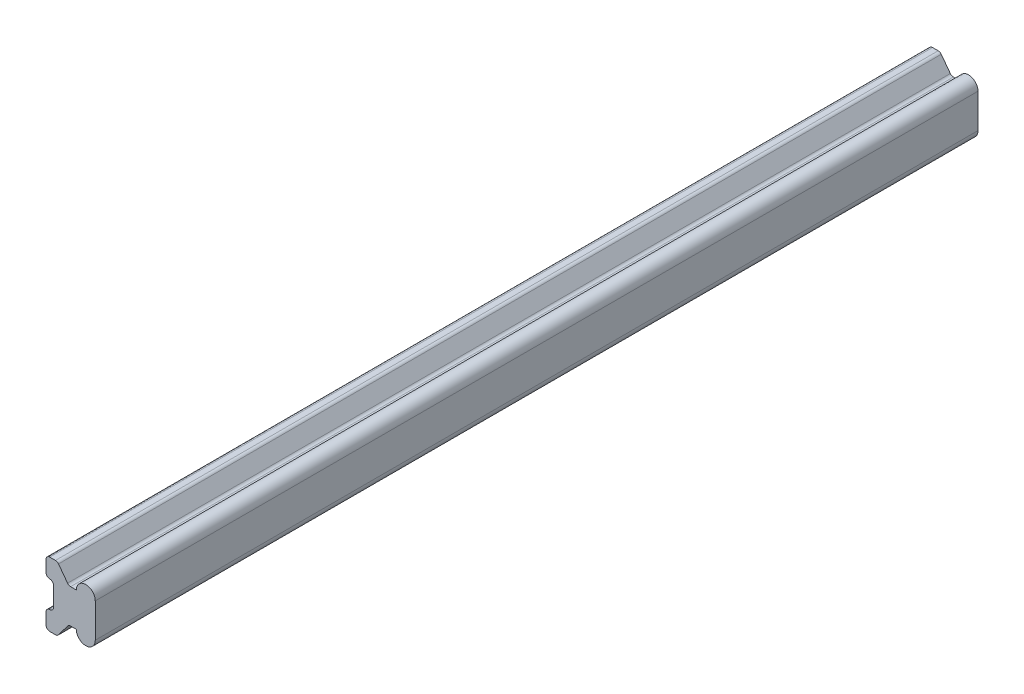
ISO-10303-21;
HEADER;
FILE_DESCRIPTION(('STEP AP214'),'2;1');
FILE_NAME('part.step','',(''),(''),'','','');
FILE_SCHEMA(('AUTOMOTIVE_DESIGN { 1 0 10303 214 1 1 1 1 }'));
ENDSEC;
DATA;
#1=APPLICATION_CONTEXT('core data for automotive mechanical design processes');
#2=APPLICATION_PROTOCOL_DEFINITION('international standard','automotive_design',2000,#1);
#3=PRODUCT_CONTEXT('',#1,'mechanical');
#4=PRODUCT('Part','Part','',(#3));
#5=PRODUCT_RELATED_PRODUCT_CATEGORY('part','',(#4));
#6=PRODUCT_DEFINITION_FORMATION('','',#4);
#7=PRODUCT_DEFINITION_CONTEXT('part definition',#1,'design');
#8=PRODUCT_DEFINITION('design','',#6,#7);
#9=PRODUCT_DEFINITION_SHAPE('','',#8);
#10=(LENGTH_UNIT() NAMED_UNIT(*) SI_UNIT(.MILLI.,.METRE.));
#11=(NAMED_UNIT(*) PLANE_ANGLE_UNIT() SI_UNIT($,.RADIAN.));
#12=(NAMED_UNIT(*) SI_UNIT($,.STERADIAN.) SOLID_ANGLE_UNIT());
#13=UNCERTAINTY_MEASURE_WITH_UNIT(LENGTH_MEASURE(1.E-05),#10,'distance_accuracy_value','');
#14=(GEOMETRIC_REPRESENTATION_CONTEXT(3) GLOBAL_UNCERTAINTY_ASSIGNED_CONTEXT((#13)) GLOBAL_UNIT_ASSIGNED_CONTEXT((#10,
#11,#12)) REPRESENTATION_CONTEXT('',''));
#15=CARTESIAN_POINT('',(0.,0.,0.));
#16=DIRECTION('',(0.,0.,1.));
#17=DIRECTION('',(1.,0.,0.));
#18=AXIS2_PLACEMENT_3D('',#15,#16,#17);
#19=CARTESIAN_POINT('',(-2.,-3.5,233.));
#20=DIRECTION('',(1.,0.,0.));
#21=DIRECTION('',(0.,1.,0.));
#22=AXIS2_PLACEMENT_3D('',#19,#20,#21);
#23=PLANE('',#22);
#24=DIRECTION('',(0.,-1.,0.));
#25=VECTOR('',#24,1.);
#26=CARTESIAN_POINT('',(-2.,-3.5,0.));
#27=LINE('',#26,#25);
#28=CARTESIAN_POINT('',(-2.,-4.5,0.));
#29=VERTEX_POINT('',#28);
#30=CARTESIAN_POINT('',(-2.,-7.5,0.));
#31=VERTEX_POINT('',#30);
#32=EDGE_CURVE('E230',#29,#31,#27,.T.);
#33=ORIENTED_EDGE('',*,*,#32,.T.);
#34=DIRECTION('',(0.,0.,-1.));
#35=VECTOR('',#34,1.);
#36=CARTESIAN_POINT('',(-2.,-7.5,233.));
#37=LINE('',#36,#35);
#38=CARTESIAN_POINT('',(-2.,-7.5,233.));
#39=VERTEX_POINT('',#38);
#40=EDGE_CURVE('E305',#31,#39,#37,.F.);
#41=ORIENTED_EDGE('',*,*,#40,.T.);
#42=DIRECTION('',(0.,-1.,0.));
#43=VECTOR('',#42,1.);
#44=CARTESIAN_POINT('',(-2.,-3.5,233.));
#45=LINE('',#44,#43);
#46=CARTESIAN_POINT('',(-2.,-4.5,233.));
#47=VERTEX_POINT('',#46);
#48=EDGE_CURVE('E610',#47,#39,#45,.T.);
#49=ORIENTED_EDGE('',*,*,#48,.F.);
#50=DIRECTION('',(0.,0.,-1.));
#51=VECTOR('',#50,1.);
#52=CARTESIAN_POINT('',(-2.,-4.5,233.));
#53=LINE('',#52,#51);
#54=EDGE_CURVE('E302',#47,#29,#53,.T.);
#55=ORIENTED_EDGE('',*,*,#54,.T.);
#56=EDGE_LOOP('',(#33,#41,#49,#55));
#57=FACE_BOUND('',#56,.T.);
#58=ADVANCED_FACE('F32',(#57),#23,.F.);
#59=CARTESIAN_POINT('',(1.,-8.5,233.));
#60=DIRECTION('',(0.,1.,0.));
#61=DIRECTION('',(0.,0.,1.));
#62=AXIS2_PLACEMENT_3D('',#59,#60,#61);
#63=PLANE('',#62);
#64=DIRECTION('',(1.,0.,0.));
#65=VECTOR('',#64,1.);
#66=CARTESIAN_POINT('',(1.,-8.5,0.));
#67=LINE('',#66,#65);
#68=CARTESIAN_POINT('',(-1.,-8.5,0.));
#69=VERTEX_POINT('',#68);
#70=CARTESIAN_POINT('',(0.5,-8.5,0.));
#71=VERTEX_POINT('',#70);
#72=EDGE_CURVE('E233',#69,#71,#67,.T.);
#73=ORIENTED_EDGE('',*,*,#72,.T.);
#74=DIRECTION('',(0.,0.,-1.));
#75=VECTOR('',#74,1.);
#76=CARTESIAN_POINT('',(0.5,-8.5,233.));
#77=LINE('',#76,#75);
#78=CARTESIAN_POINT('',(0.5,-8.5,233.));
#79=VERTEX_POINT('',#78);
#80=EDGE_CURVE('E289',#71,#79,#77,.F.);
#81=ORIENTED_EDGE('',*,*,#80,.T.);
#82=DIRECTION('',(1.,0.,0.));
#83=VECTOR('',#82,1.);
#84=CARTESIAN_POINT('',(1.,-8.5,233.));
#85=LINE('',#84,#83);
#86=CARTESIAN_POINT('',(-1.,-8.5,233.));
#87=VERTEX_POINT('',#86);
#88=EDGE_CURVE('E609',#87,#79,#85,.T.);
#89=ORIENTED_EDGE('',*,*,#88,.F.);
#90=DIRECTION('',(0.,0.,-1.));
#91=VECTOR('',#90,1.);
#92=CARTESIAN_POINT('',(-1.,-8.5,233.));
#93=LINE('',#92,#91);
#94=EDGE_CURVE('E286',#87,#69,#93,.T.);
#95=ORIENTED_EDGE('',*,*,#94,.T.);
#96=EDGE_LOOP('',(#73,#81,#89,#95));
#97=FACE_BOUND('',#96,.T.);
#98=ADVANCED_FACE('F400',(#97),#63,.F.);
#99=CARTESIAN_POINT('',(1.,-8.5,233.));
#100=DIRECTION('',(-0.8,0.6,0.));
#101=DIRECTION('',(-0.6,-0.8,0.));
#102=AXIS2_PLACEMENT_3D('',#99,#100,#101);
#103=PLANE('',#102);
#104=DIRECTION('',(0.6,0.8,0.));
#105=VECTOR('',#104,1.);
#106=CARTESIAN_POINT('',(1.,-8.5,0.));
#107=LINE('',#106,#105);
#108=CARTESIAN_POINT('',(1.3,-8.1,0.));
#109=VERTEX_POINT('',#108);
#110=CARTESIAN_POINT('',(3.7,-4.9,0.));
#111=VERTEX_POINT('',#110);
#112=EDGE_CURVE('E237',#109,#111,#107,.T.);
#113=ORIENTED_EDGE('',*,*,#112,.T.);
#114=DIRECTION('',(0.,0.,-1.));
#115=VECTOR('',#114,1.);
#116=CARTESIAN_POINT('',(3.7,-4.9,233.));
#117=LINE('',#116,#115);
#118=CARTESIAN_POINT('',(3.7,-4.9,233.));
#119=VERTEX_POINT('',#118);
#120=EDGE_CURVE('E272',#111,#119,#117,.F.);
#121=ORIENTED_EDGE('',*,*,#120,.T.);
#122=DIRECTION('',(0.6,0.8,0.));
#123=VECTOR('',#122,1.);
#124=CARTESIAN_POINT('',(1.,-8.5,233.));
#125=LINE('',#124,#123);
#126=CARTESIAN_POINT('',(1.3,-8.1,233.));
#127=VERTEX_POINT('',#126);
#128=EDGE_CURVE('E195',#127,#119,#125,.T.);
#129=ORIENTED_EDGE('',*,*,#128,.F.);
#130=DIRECTION('',(0.,0.,-1.));
#131=VECTOR('',#130,1.);
#132=CARTESIAN_POINT('',(1.3,-8.1,233.));
#133=LINE('',#132,#131);
#134=EDGE_CURVE('E269',#127,#109,#133,.T.);
#135=ORIENTED_EDGE('',*,*,#134,.T.);
#136=EDGE_LOOP('',(#113,#121,#129,#135));
#137=FACE_BOUND('',#136,.T.);
#138=ADVANCED_FACE('F406',(#137),#103,.F.);
#139=CARTESIAN_POINT('',(6.,-4.5,233.));
#140=DIRECTION('',(0.,1.,0.));
#141=DIRECTION('',(0.,0.,1.));
#142=AXIS2_PLACEMENT_3D('',#139,#140,#141);
#143=PLANE('',#142);
#144=DIRECTION('',(1.,0.,0.));
#145=VECTOR('',#144,1.);
#146=CARTESIAN_POINT('',(6.,-4.5,233.));
#147=LINE('',#146,#145);
#148=CARTESIAN_POINT('',(4.5,-4.5,233.));
#149=VERTEX_POINT('',#148);
#150=CARTESIAN_POINT('',(6.,-4.5,233.));
#151=VERTEX_POINT('',#150);
#152=EDGE_CURVE('E182',#149,#151,#147,.T.);
#153=ORIENTED_EDGE('',*,*,#152,.F.);
#154=DIRECTION('',(0.,0.,-1.));
#155=VECTOR('',#154,1.);
#156=CARTESIAN_POINT('',(4.5,-4.5,0.));
#157=LINE('',#156,#155);
#158=CARTESIAN_POINT('',(4.5,-4.5,0.));
#159=VERTEX_POINT('',#158);
#160=EDGE_CURVE('E205',#149,#159,#157,.T.);
#161=ORIENTED_EDGE('',*,*,#160,.T.);
#162=DIRECTION('',(1.,0.,0.));
#163=VECTOR('',#162,1.);
#164=CARTESIAN_POINT('',(6.,-4.5,0.));
#165=LINE('',#164,#163);
#166=CARTESIAN_POINT('',(6.,-4.5,0.));
#167=VERTEX_POINT('',#166);
#168=EDGE_CURVE('E201',#159,#167,#165,.T.);
#169=ORIENTED_EDGE('',*,*,#168,.T.);
#170=DIRECTION('',(0.,0.,-1.));
#171=VECTOR('',#170,1.);
#172=CARTESIAN_POINT('',(6.,-4.5,233.));
#173=LINE('',#172,#171);
#174=EDGE_CURVE('E198',#151,#167,#173,.T.);
#175=ORIENTED_EDGE('',*,*,#174,.F.);
#176=EDGE_LOOP('',(#153,#161,#169,#175));
#177=FACE_BOUND('',#176,.T.);
#178=ADVANCED_FACE('F199',(#177),#143,.F.);
#179=CARTESIAN_POINT('',(8.5,-4.5,233.));
#180=DIRECTION('',(0.,0.,-1.));
#181=DIRECTION('',(-1.,0.,0.));
#182=AXIS2_PLACEMENT_3D('',#179,#180,#181);
#183=CYLINDRICAL_SURFACE('',#182,2.5);
#184=CARTESIAN_POINT('',(8.5,-4.5,0.));
#185=DIRECTION('',(0.,0.,1.));
#186=DIRECTION('',(1.,0.,0.));
#187=AXIS2_PLACEMENT_3D('',#184,#185,#186);
#188=CIRCLE('',#187,2.5);
#189=CARTESIAN_POINT('',(11.,-4.5,0.));
#190=VERTEX_POINT('',#189);
#191=EDGE_CURVE('E241',#167,#190,#188,.T.);
#192=ORIENTED_EDGE('',*,*,#191,.T.);
#193=DIRECTION('',(0.,0.,-1.));
#194=VECTOR('',#193,1.);
#195=CARTESIAN_POINT('',(11.,-4.5,233.));
#196=LINE('',#195,#194);
#197=CARTESIAN_POINT('',(11.,-4.5,233.));
#198=VERTEX_POINT('',#197);
#199=EDGE_CURVE('E206',#198,#190,#196,.T.);
#200=ORIENTED_EDGE('',*,*,#199,.F.);
#201=CARTESIAN_POINT('',(8.5,-4.5,233.));
#202=DIRECTION('',(0.,0.,1.));
#203=DIRECTION('',(1.,0.,0.));
#204=AXIS2_PLACEMENT_3D('',#201,#202,#203);
#205=CIRCLE('',#204,2.5);
#206=EDGE_CURVE('E187',#151,#198,#205,.T.);
#207=ORIENTED_EDGE('',*,*,#206,.F.);
#208=ORIENTED_EDGE('',*,*,#174,.T.);
#209=EDGE_LOOP('',(#192,#200,#207,#208));
#210=FACE_BOUND('',#209,.T.);
#211=ADVANCED_FACE('F208',(#210),#183,.T.);
#212=CARTESIAN_POINT('',(11.,0.,233.));
#213=DIRECTION('',(-1.,0.,0.));
#214=DIRECTION('',(0.,0.,1.));
#215=AXIS2_PLACEMENT_3D('',#212,#213,#214);
#216=PLANE('',#215);
#217=DIRECTION('',(0.,1.,0.));
#218=VECTOR('',#217,1.);
#219=CARTESIAN_POINT('',(11.,0.,0.));
#220=LINE('',#219,#218);
#221=CARTESIAN_POINT('',(11.,4.5,0.));
#222=VERTEX_POINT('',#221);
#223=EDGE_CURVE('E243',#190,#222,#220,.T.);
#224=ORIENTED_EDGE('',*,*,#223,.T.);
#225=DIRECTION('',(0.,0.,-1.));
#226=VECTOR('',#225,1.);
#227=CARTESIAN_POINT('',(11.,4.5,233.));
#228=LINE('',#227,#226);
#229=CARTESIAN_POINT('',(11.,4.5,233.));
#230=VERTEX_POINT('',#229);
#231=EDGE_CURVE('E264',#230,#222,#228,.T.);
#232=ORIENTED_EDGE('',*,*,#231,.F.);
#233=DIRECTION('',(0.,1.,0.));
#234=VECTOR('',#233,1.);
#235=CARTESIAN_POINT('',(11.,0.,233.));
#236=LINE('',#235,#234);
#237=EDGE_CURVE('E211',#198,#230,#236,.T.);
#238=ORIENTED_EDGE('',*,*,#237,.F.);
#239=ORIENTED_EDGE('',*,*,#199,.T.);
#240=EDGE_LOOP('',(#224,#232,#238,#239));
#241=FACE_BOUND('',#240,.T.);
#242=ADVANCED_FACE('F390',(#241),#216,.F.);
#243=CARTESIAN_POINT('',(8.5,4.5,233.));
#244=DIRECTION('',(0.,0.,-1.));
#245=DIRECTION('',(-1.,0.,0.));
#246=AXIS2_PLACEMENT_3D('',#243,#244,#245);
#247=CYLINDRICAL_SURFACE('',#246,2.5);
#248=CARTESIAN_POINT('',(8.5,4.5,0.));
#249=DIRECTION('',(0.,0.,1.));
#250=DIRECTION('',(1.,0.,0.));
#251=AXIS2_PLACEMENT_3D('',#248,#249,#250);
#252=CIRCLE('',#251,2.5);
#253=CARTESIAN_POINT('',(6.,4.5,0.));
#254=VERTEX_POINT('',#253);
#255=EDGE_CURVE('E245',#222,#254,#252,.T.);
#256=ORIENTED_EDGE('',*,*,#255,.T.);
#257=DIRECTION('',(0.,0.,-1.));
#258=VECTOR('',#257,1.);
#259=CARTESIAN_POINT('',(6.,4.5,233.));
#260=LINE('',#259,#258);
#261=CARTESIAN_POINT('',(6.,4.5,233.));
#262=VERTEX_POINT('',#261);
#263=EDGE_CURVE('E229',#262,#254,#260,.T.);
#264=ORIENTED_EDGE('',*,*,#263,.F.);
#265=CARTESIAN_POINT('',(8.5,4.5,233.));
#266=DIRECTION('',(0.,0.,1.));
#267=DIRECTION('',(1.,0.,0.));
#268=AXIS2_PLACEMENT_3D('',#265,#266,#267);
#269=CIRCLE('',#268,2.5);
#270=EDGE_CURVE('E213',#230,#262,#269,.T.);
#271=ORIENTED_EDGE('',*,*,#270,.F.);
#272=ORIENTED_EDGE('',*,*,#231,.T.);
#273=EDGE_LOOP('',(#256,#264,#271,#272));
#274=FACE_BOUND('',#273,.T.);
#275=ADVANCED_FACE('F387',(#274),#247,.T.);
#276=CARTESIAN_POINT('',(4.,4.5,233.));
#277=DIRECTION('',(0.,-1.,0.));
#278=DIRECTION('',(0.,0.,-1.));
#279=AXIS2_PLACEMENT_3D('',#276,#277,#278);
#280=PLANE('',#279);
#281=DIRECTION('',(-1.,0.,0.));
#282=VECTOR('',#281,1.);
#283=CARTESIAN_POINT('',(4.,4.5,0.));
#284=LINE('',#283,#282);
#285=CARTESIAN_POINT('',(4.5,4.5,0.));
#286=VERTEX_POINT('',#285);
#287=EDGE_CURVE('E247',#254,#286,#284,.T.);
#288=ORIENTED_EDGE('',*,*,#287,.T.);
#289=DIRECTION('',(0.,0.,-1.));
#290=VECTOR('',#289,1.);
#291=CARTESIAN_POINT('',(4.5,4.5,233.));
#292=LINE('',#291,#290);
#293=CARTESIAN_POINT('',(4.5,4.5,233.));
#294=VERTEX_POINT('',#293);
#295=EDGE_CURVE('E326',#286,#294,#292,.F.);
#296=ORIENTED_EDGE('',*,*,#295,.T.);
#297=DIRECTION('',(-1.,0.,0.));
#298=VECTOR('',#297,1.);
#299=CARTESIAN_POINT('',(4.,4.5,233.));
#300=LINE('',#299,#298);
#301=EDGE_CURVE('E218',#262,#294,#300,.T.);
#302=ORIENTED_EDGE('',*,*,#301,.F.);
#303=ORIENTED_EDGE('',*,*,#263,.T.);
#304=EDGE_LOOP('',(#288,#296,#302,#303));
#305=FACE_BOUND('',#304,.T.);
#306=ADVANCED_FACE('F382',(#305),#280,.F.);
#307=CARTESIAN_POINT('',(4.,4.5,233.));
#308=DIRECTION('',(-0.8,-0.6,0.));
#309=DIRECTION('',(0.6,-0.8,0.));
#310=AXIS2_PLACEMENT_3D('',#307,#308,#309);
#311=PLANE('',#310);
#312=DIRECTION('',(-0.6,0.8,0.));
#313=VECTOR('',#312,1.);
#314=CARTESIAN_POINT('',(4.,4.5,0.));
#315=LINE('',#314,#313);
#316=CARTESIAN_POINT('',(3.7,4.9,0.));
#317=VERTEX_POINT('',#316);
#318=CARTESIAN_POINT('',(1.3,8.1,0.));
#319=VERTEX_POINT('',#318);
#320=EDGE_CURVE('E250',#317,#319,#315,.T.);
#321=ORIENTED_EDGE('',*,*,#320,.T.);
#322=DIRECTION('',(0.,0.,-1.));
#323=VECTOR('',#322,1.);
#324=CARTESIAN_POINT('',(1.3,8.1,233.));
#325=LINE('',#324,#323);
#326=CARTESIAN_POINT('',(1.3,8.1,233.));
#327=VERTEX_POINT('',#326);
#328=EDGE_CURVE('E324',#319,#327,#325,.F.);
#329=ORIENTED_EDGE('',*,*,#328,.T.);
#330=DIRECTION('',(-0.6,0.8,0.));
#331=VECTOR('',#330,1.);
#332=CARTESIAN_POINT('',(4.,4.5,233.));
#333=LINE('',#332,#331);
#334=CARTESIAN_POINT('',(3.7,4.9,233.));
#335=VERTEX_POINT('',#334);
#336=EDGE_CURVE('E221',#335,#327,#333,.T.);
#337=ORIENTED_EDGE('',*,*,#336,.F.);
#338=DIRECTION('',(0.,0.,-1.));
#339=VECTOR('',#338,1.);
#340=CARTESIAN_POINT('',(3.7,4.9,0.));
#341=LINE('',#340,#339);
#342=EDGE_CURVE('E321',#335,#317,#341,.T.);
#343=ORIENTED_EDGE('',*,*,#342,.T.);
#344=EDGE_LOOP('',(#321,#329,#337,#343));
#345=FACE_BOUND('',#344,.T.);
#346=ADVANCED_FACE('F373',(#345),#311,.F.);
#347=CARTESIAN_POINT('',(-2.,8.5,233.));
#348=DIRECTION('',(0.,-1.,0.));
#349=DIRECTION('',(0.,0.,-1.));
#350=AXIS2_PLACEMENT_3D('',#347,#348,#349);
#351=PLANE('',#350);
#352=DIRECTION('',(-1.,0.,0.));
#353=VECTOR('',#352,1.);
#354=CARTESIAN_POINT('',(-2.,8.5,0.));
#355=LINE('',#354,#353);
#356=CARTESIAN_POINT('',(0.5,8.5,0.));
#357=VERTEX_POINT('',#356);
#358=CARTESIAN_POINT('',(-1.,8.5,0.));
#359=VERTEX_POINT('',#358);
#360=EDGE_CURVE('E253',#357,#359,#355,.T.);
#361=ORIENTED_EDGE('',*,*,#360,.T.);
#362=DIRECTION('',(0.,0.,-1.));
#363=VECTOR('',#362,1.);
#364=CARTESIAN_POINT('',(-1.,8.5,233.));
#365=LINE('',#364,#363);
#366=CARTESIAN_POINT('',(-1.,8.5,233.));
#367=VERTEX_POINT('',#366);
#368=EDGE_CURVE('E319',#359,#367,#365,.F.);
#369=ORIENTED_EDGE('',*,*,#368,.T.);
#370=DIRECTION('',(-1.,0.,0.));
#371=VECTOR('',#370,1.);
#372=CARTESIAN_POINT('',(-2.,8.5,233.));
#373=LINE('',#372,#371);
#374=CARTESIAN_POINT('',(0.5,8.5,233.));
#375=VERTEX_POINT('',#374);
#376=EDGE_CURVE('E224',#375,#367,#373,.T.);
#377=ORIENTED_EDGE('',*,*,#376,.F.);
#378=DIRECTION('',(0.,0.,-1.));
#379=VECTOR('',#378,1.);
#380=CARTESIAN_POINT('',(0.5,8.5,233.));
#381=LINE('',#380,#379);
#382=EDGE_CURVE('E316',#375,#357,#381,.T.);
#383=ORIENTED_EDGE('',*,*,#382,.T.);
#384=EDGE_LOOP('',(#361,#369,#377,#383));
#385=FACE_BOUND('',#384,.T.);
#386=ADVANCED_FACE('F364',(#385),#351,.F.);
#387=CARTESIAN_POINT('',(-2.,3.5,233.));
#388=DIRECTION('',(1.,0.,0.));
#389=DIRECTION('',(0.,0.,-1.));
#390=AXIS2_PLACEMENT_3D('',#387,#388,#389);
#391=PLANE('',#390);
#392=DIRECTION('',(0.,-1.,0.));
#393=VECTOR('',#392,1.);
#394=CARTESIAN_POINT('',(-2.,3.5,0.));
#395=LINE('',#394,#393);
#396=CARTESIAN_POINT('',(-2.,7.5,0.));
#397=VERTEX_POINT('',#396);
#398=CARTESIAN_POINT('',(-2.,4.5,0.));
#399=VERTEX_POINT('',#398);
#400=EDGE_CURVE('E256',#397,#399,#395,.T.);
#401=ORIENTED_EDGE('',*,*,#400,.T.);
#402=DIRECTION('',(0.,0.,-1.));
#403=VECTOR('',#402,1.);
#404=CARTESIAN_POINT('',(-2.,4.5,233.));
#405=LINE('',#404,#403);
#406=CARTESIAN_POINT('',(-2.,4.5,233.));
#407=VERTEX_POINT('',#406);
#408=EDGE_CURVE('E57',#399,#407,#405,.F.);
#409=ORIENTED_EDGE('',*,*,#408,.T.);
#410=DIRECTION('',(0.,-1.,0.));
#411=VECTOR('',#410,1.);
#412=CARTESIAN_POINT('',(-2.,3.5,233.));
#413=LINE('',#412,#411);
#414=CARTESIAN_POINT('',(-2.,7.5,233.));
#415=VERTEX_POINT('',#414);
#416=EDGE_CURVE('E227',#415,#407,#413,.T.);
#417=ORIENTED_EDGE('',*,*,#416,.F.);
#418=DIRECTION('',(0.,0.,-1.));
#419=VECTOR('',#418,1.);
#420=CARTESIAN_POINT('',(-2.,7.5,233.));
#421=LINE('',#420,#419);
#422=EDGE_CURVE('E312',#415,#397,#421,.T.);
#423=ORIENTED_EDGE('',*,*,#422,.T.);
#424=EDGE_LOOP('',(#401,#409,#417,#423));
#425=FACE_BOUND('',#424,.T.);
#426=ADVANCED_FACE('F356',(#425),#391,.F.);
#427=CARTESIAN_POINT('',(0.,0.,233.));
#428=DIRECTION('',(1.,0.,0.));
#429=DIRECTION('',(0.,0.,-1.));
#430=AXIS2_PLACEMENT_3D('',#427,#428,#429);
#431=PLANE('',#430);
#432=DIRECTION('',(0.,-1.,0.));
#433=VECTOR('',#432,1.);
#434=CARTESIAN_POINT('',(0.,0.,0.));
#435=LINE('',#434,#433);
#436=CARTESIAN_POINT('',(0.,2.5,0.));
#437=VERTEX_POINT('',#436);
#438=CARTESIAN_POINT('',(0.,-2.5,0.));
#439=VERTEX_POINT('',#438);
#440=EDGE_CURVE('E258',#437,#439,#435,.T.);
#441=ORIENTED_EDGE('',*,*,#440,.T.);
#442=DIRECTION('',(0.,0.,-1.));
#443=VECTOR('',#442,1.);
#444=CARTESIAN_POINT('',(0.,-2.5,233.));
#445=LINE('',#444,#443);
#446=CARTESIAN_POINT('',(0.,-2.5,233.));
#447=VERTEX_POINT('',#446);
#448=EDGE_CURVE('E310',#439,#447,#445,.F.);
#449=ORIENTED_EDGE('',*,*,#448,.T.);
#450=DIRECTION('',(0.,-1.,0.));
#451=VECTOR('',#450,1.);
#452=CARTESIAN_POINT('',(0.,0.,233.));
#453=LINE('',#452,#451);
#454=CARTESIAN_POINT('',(0.,2.5,233.));
#455=VERTEX_POINT('',#454);
#456=EDGE_CURVE('E261',#455,#447,#453,.T.);
#457=ORIENTED_EDGE('',*,*,#456,.F.);
#458=DIRECTION('',(0.,0.,-1.));
#459=VECTOR('',#458,1.);
#460=CARTESIAN_POINT('',(0.,2.5,0.));
#461=LINE('',#460,#459);
#462=EDGE_CURVE('E307',#455,#437,#461,.T.);
#463=ORIENTED_EDGE('',*,*,#462,.T.);
#464=EDGE_LOOP('',(#441,#449,#457,#463));
#465=FACE_BOUND('',#464,.T.);
#466=ADVANCED_FACE('F510',(#465),#431,.F.);
#467=CARTESIAN_POINT('',(8.5,-4.5,233.));
#468=DIRECTION('',(0.,0.,1.));
#469=DIRECTION('',(1.,0.,0.));
#470=AXIS2_PLACEMENT_3D('',#467,#468,#469);
#471=PLANE('',#470);
#472=ORIENTED_EDGE('',*,*,#88,.T.);
#473=CARTESIAN_POINT('',(0.5,-7.5,233.));
#474=DIRECTION('',(0.,0.,1.));
#475=DIRECTION('',(1.,0.,0.));
#476=AXIS2_PLACEMENT_3D('',#473,#474,#475);
#477=CIRCLE('',#476,1.);
#478=EDGE_CURVE('E300',#79,#127,#477,.T.);
#479=ORIENTED_EDGE('',*,*,#478,.T.);
#480=ORIENTED_EDGE('',*,*,#128,.T.);
#481=CARTESIAN_POINT('',(4.5,-5.5,233.));
#482=DIRECTION('',(0.,0.,1.));
#483=DIRECTION('',(1.,0.,0.));
#484=AXIS2_PLACEMENT_3D('',#481,#482,#483);
#485=CIRCLE('',#484,1.);
#486=EDGE_CURVE('E191',#119,#149,#485,.F.);
#487=ORIENTED_EDGE('',*,*,#486,.T.);
#488=ORIENTED_EDGE('',*,*,#152,.T.);
#489=ORIENTED_EDGE('',*,*,#206,.T.);
#490=ORIENTED_EDGE('',*,*,#237,.T.);
#491=ORIENTED_EDGE('',*,*,#270,.T.);
#492=ORIENTED_EDGE('',*,*,#301,.T.);
#493=CARTESIAN_POINT('',(4.5,5.5,233.));
#494=DIRECTION('',(0.,0.,1.));
#495=DIRECTION('',(1.,0.,0.));
#496=AXIS2_PLACEMENT_3D('',#493,#494,#495);
#497=CIRCLE('',#496,1.);
#498=EDGE_CURVE('E11',#294,#335,#497,.F.);
#499=ORIENTED_EDGE('',*,*,#498,.T.);
#500=ORIENTED_EDGE('',*,*,#336,.T.);
#501=CARTESIAN_POINT('',(0.5,7.5,233.));
#502=DIRECTION('',(0.,0.,1.));
#503=DIRECTION('',(1.,0.,0.));
#504=AXIS2_PLACEMENT_3D('',#501,#502,#503);
#505=CIRCLE('',#504,1.);
#506=EDGE_CURVE('E291',#327,#375,#505,.T.);
#507=ORIENTED_EDGE('',*,*,#506,.T.);
#508=ORIENTED_EDGE('',*,*,#376,.T.);
#509=CARTESIAN_POINT('',(-1.,7.5,233.));
#510=DIRECTION('',(0.,0.,1.));
#511=DIRECTION('',(1.,0.,0.));
#512=AXIS2_PLACEMENT_3D('',#509,#510,#511);
#513=CIRCLE('',#512,1.);
#514=EDGE_CURVE('E293',#367,#415,#513,.T.);
#515=ORIENTED_EDGE('',*,*,#514,.T.);
#516=ORIENTED_EDGE('',*,*,#416,.T.);
#517=CARTESIAN_POINT('',(-1.,4.5,233.));
#518=DIRECTION('',(0.,0.,1.));
#519=DIRECTION('',(1.,0.,0.));
#520=AXIS2_PLACEMENT_3D('',#517,#518,#519);
#521=CIRCLE('',#520,1.);
#522=CARTESIAN_POINT('',(-1.,3.5,233.));
#523=VERTEX_POINT('',#522);
#524=EDGE_CURVE('E49',#407,#523,#521,.T.);
#525=ORIENTED_EDGE('',*,*,#524,.T.);
#526=CARTESIAN_POINT('',(-1.,2.5,233.));
#527=DIRECTION('',(0.,0.,1.));
#528=DIRECTION('',(1.,0.,0.));
#529=AXIS2_PLACEMENT_3D('',#526,#527,#528);
#530=CIRCLE('',#529,1.);
#531=EDGE_CURVE('E337',#523,#455,#530,.F.);
#532=ORIENTED_EDGE('',*,*,#531,.T.);
#533=ORIENTED_EDGE('',*,*,#456,.T.);
#534=CARTESIAN_POINT('',(-1.,-2.5,233.));
#535=DIRECTION('',(0.,0.,1.));
#536=DIRECTION('',(1.,0.,0.));
#537=AXIS2_PLACEMENT_3D('',#534,#535,#536);
#538=CIRCLE('',#537,1.);
#539=CARTESIAN_POINT('',(-1.,-3.5,233.));
#540=VERTEX_POINT('',#539);
#541=EDGE_CURVE('E333',#447,#540,#538,.F.);
#542=ORIENTED_EDGE('',*,*,#541,.T.);
#543=CARTESIAN_POINT('',(-1.,-4.5,233.));
#544=DIRECTION('',(0.,0.,1.));
#545=DIRECTION('',(1.,0.,0.));
#546=AXIS2_PLACEMENT_3D('',#543,#544,#545);
#547=CIRCLE('',#546,1.);
#548=EDGE_CURVE('E296',#540,#47,#547,.T.);
#549=ORIENTED_EDGE('',*,*,#548,.T.);
#550=ORIENTED_EDGE('',*,*,#48,.T.);
#551=CARTESIAN_POINT('',(-1.,-7.5,233.));
#552=DIRECTION('',(0.,0.,1.));
#553=DIRECTION('',(1.,0.,0.));
#554=AXIS2_PLACEMENT_3D('',#551,#552,#553);
#555=CIRCLE('',#554,1.);
#556=EDGE_CURVE('E298',#39,#87,#555,.T.);
#557=ORIENTED_EDGE('',*,*,#556,.T.);
#558=EDGE_LOOP('',(#472,#479,#480,#487,#488,#489,#490,#491,#492,#499,#500,#507,#508,#515,#516,
#525,#532,#533,#542,#549,#550,#557));
#559=FACE_BOUND('',#558,.T.);
#560=ADVANCED_FACE('F185',(#559),#471,.T.);
#561=CARTESIAN_POINT('',(8.5,-4.5,0.));
#562=DIRECTION('',(0.,0.,1.));
#563=DIRECTION('',(1.,0.,0.));
#564=AXIS2_PLACEMENT_3D('',#561,#562,#563);
#565=PLANE('',#564);
#566=ORIENTED_EDGE('',*,*,#112,.F.);
#567=CARTESIAN_POINT('',(0.5,-7.5,0.));
#568=DIRECTION('',(0.,0.,1.));
#569=DIRECTION('',(1.,0.,0.));
#570=AXIS2_PLACEMENT_3D('',#567,#568,#569);
#571=CIRCLE('',#570,1.);
#572=EDGE_CURVE('E284',#109,#71,#571,.F.);
#573=ORIENTED_EDGE('',*,*,#572,.T.);
#574=ORIENTED_EDGE('',*,*,#72,.F.);
#575=CARTESIAN_POINT('',(-1.,-7.5,0.));
#576=DIRECTION('',(0.,0.,1.));
#577=DIRECTION('',(1.,0.,0.));
#578=AXIS2_PLACEMENT_3D('',#575,#576,#577);
#579=CIRCLE('',#578,1.);
#580=EDGE_CURVE('E282',#69,#31,#579,.F.);
#581=ORIENTED_EDGE('',*,*,#580,.T.);
#582=ORIENTED_EDGE('',*,*,#32,.F.);
#583=CARTESIAN_POINT('',(-1.,-4.5,0.));
#584=DIRECTION('',(0.,0.,1.));
#585=DIRECTION('',(1.,0.,0.));
#586=AXIS2_PLACEMENT_3D('',#583,#584,#585);
#587=CIRCLE('',#586,1.);
#588=CARTESIAN_POINT('',(-1.,-3.5,0.));
#589=VERTEX_POINT('',#588);
#590=EDGE_CURVE('E280',#29,#589,#587,.F.);
#591=ORIENTED_EDGE('',*,*,#590,.T.);
#592=CARTESIAN_POINT('',(-1.,-2.5,0.));
#593=DIRECTION('',(0.,0.,1.));
#594=DIRECTION('',(1.,0.,0.));
#595=AXIS2_PLACEMENT_3D('',#592,#593,#594);
#596=CIRCLE('',#595,1.);
#597=EDGE_CURVE('E331',#589,#439,#596,.T.);
#598=ORIENTED_EDGE('',*,*,#597,.T.);
#599=ORIENTED_EDGE('',*,*,#440,.F.);
#600=CARTESIAN_POINT('',(-1.,2.5,0.));
#601=DIRECTION('',(0.,0.,1.));
#602=DIRECTION('',(1.,0.,0.));
#603=AXIS2_PLACEMENT_3D('',#600,#601,#602);
#604=CIRCLE('',#603,1.);
#605=CARTESIAN_POINT('',(-1.,3.5,0.));
#606=VERTEX_POINT('',#605);
#607=EDGE_CURVE('E335',#437,#606,#604,.T.);
#608=ORIENTED_EDGE('',*,*,#607,.T.);
#609=CARTESIAN_POINT('',(-1.,4.5,0.));
#610=DIRECTION('',(0.,0.,1.));
#611=DIRECTION('',(1.,0.,0.));
#612=AXIS2_PLACEMENT_3D('',#609,#610,#611);
#613=CIRCLE('',#612,1.);
#614=EDGE_CURVE('E278',#606,#399,#613,.F.);
#615=ORIENTED_EDGE('',*,*,#614,.T.);
#616=ORIENTED_EDGE('',*,*,#400,.F.);
#617=CARTESIAN_POINT('',(-1.,7.5,0.));
#618=DIRECTION('',(0.,0.,1.));
#619=DIRECTION('',(1.,0.,0.));
#620=AXIS2_PLACEMENT_3D('',#617,#618,#619);
#621=CIRCLE('',#620,1.);
#622=EDGE_CURVE('E276',#397,#359,#621,.F.);
#623=ORIENTED_EDGE('',*,*,#622,.T.);
#624=ORIENTED_EDGE('',*,*,#360,.F.);
#625=CARTESIAN_POINT('',(0.5,7.5,0.));
#626=DIRECTION('',(0.,0.,1.));
#627=DIRECTION('',(1.,0.,0.));
#628=AXIS2_PLACEMENT_3D('',#625,#626,#627);
#629=CIRCLE('',#628,1.);
#630=EDGE_CURVE('E274',#357,#319,#629,.F.);
#631=ORIENTED_EDGE('',*,*,#630,.T.);
#632=ORIENTED_EDGE('',*,*,#320,.F.);
#633=CARTESIAN_POINT('',(4.5,5.5,0.));
#634=DIRECTION('',(0.,0.,1.));
#635=DIRECTION('',(1.,0.,0.));
#636=AXIS2_PLACEMENT_3D('',#633,#634,#635);
#637=CIRCLE('',#636,1.);
#638=EDGE_CURVE('E41',#317,#286,#637,.T.);
#639=ORIENTED_EDGE('',*,*,#638,.T.);
#640=ORIENTED_EDGE('',*,*,#287,.F.);
#641=ORIENTED_EDGE('',*,*,#255,.F.);
#642=ORIENTED_EDGE('',*,*,#223,.F.);
#643=ORIENTED_EDGE('',*,*,#191,.F.);
#644=ORIENTED_EDGE('',*,*,#168,.F.);
#645=CARTESIAN_POINT('',(4.5,-5.5,0.));
#646=DIRECTION('',(0.,0.,1.));
#647=DIRECTION('',(1.,0.,0.));
#648=AXIS2_PLACEMENT_3D('',#645,#646,#647);
#649=CIRCLE('',#648,1.);
#650=EDGE_CURVE('E328',#159,#111,#649,.T.);
#651=ORIENTED_EDGE('',*,*,#650,.T.);
#652=EDGE_LOOP('',(#566,#573,#574,#581,#582,#591,#598,#599,#608,#615,#616,#623,#624,#631,#632,
#639,#640,#641,#642,#643,#644,#651));
#653=FACE_BOUND('',#652,.T.);
#654=ADVANCED_FACE('F354',(#653),#565,.F.);
#655=CARTESIAN_POINT('',(4.5,-5.5,233.));
#656=DIRECTION('',(0.,0.,1.));
#657=DIRECTION('',(1.,0.,0.));
#658=AXIS2_PLACEMENT_3D('',#655,#656,#657);
#659=CYLINDRICAL_SURFACE('',#658,1.);
#660=ORIENTED_EDGE('',*,*,#486,.F.);
#661=ORIENTED_EDGE('',*,*,#120,.F.);
#662=ORIENTED_EDGE('',*,*,#650,.F.);
#663=ORIENTED_EDGE('',*,*,#160,.F.);
#664=EDGE_LOOP('',(#660,#661,#662,#663));
#665=FACE_BOUND('',#664,.T.);
#666=ADVANCED_FACE('F411',(#665),#659,.F.);
#667=CARTESIAN_POINT('',(0.5,-7.5,233.));
#668=DIRECTION('',(0.,0.,-1.));
#669=DIRECTION('',(-1.,0.,0.));
#670=AXIS2_PLACEMENT_3D('',#667,#668,#669);
#671=CYLINDRICAL_SURFACE('',#670,1.);
#672=ORIENTED_EDGE('',*,*,#478,.F.);
#673=ORIENTED_EDGE('',*,*,#80,.F.);
#674=ORIENTED_EDGE('',*,*,#572,.F.);
#675=ORIENTED_EDGE('',*,*,#134,.F.);
#676=EDGE_LOOP('',(#672,#673,#674,#675));
#677=FACE_BOUND('',#676,.T.);
#678=ADVANCED_FACE('F414',(#677),#671,.T.);
#679=CARTESIAN_POINT('',(-1.,-7.5,233.));
#680=DIRECTION('',(0.,0.,-1.));
#681=DIRECTION('',(-1.,0.,0.));
#682=AXIS2_PLACEMENT_3D('',#679,#680,#681);
#683=CYLINDRICAL_SURFACE('',#682,1.);
#684=ORIENTED_EDGE('',*,*,#556,.F.);
#685=ORIENTED_EDGE('',*,*,#40,.F.);
#686=ORIENTED_EDGE('',*,*,#580,.F.);
#687=ORIENTED_EDGE('',*,*,#94,.F.);
#688=EDGE_LOOP('',(#684,#685,#686,#687));
#689=FACE_BOUND('',#688,.T.);
#690=ADVANCED_FACE('F418',(#689),#683,.T.);
#691=CARTESIAN_POINT('',(-1.,-2.5,233.));
#692=DIRECTION('',(0.,0.,1.));
#693=DIRECTION('',(1.,0.,0.));
#694=AXIS2_PLACEMENT_3D('',#691,#692,#693);
#695=CYLINDRICAL_SURFACE('',#694,1.);
#696=DIRECTION('',(0.,0.,-1.));
#697=VECTOR('',#696,1.);
#698=CARTESIAN_POINT('',(-1.,-3.5,0.));
#699=LINE('',#698,#697);
#700=EDGE_CURVE('E234',#540,#589,#699,.T.);
#701=ORIENTED_EDGE('',*,*,#700,.F.);
#702=ORIENTED_EDGE('',*,*,#541,.F.);
#703=ORIENTED_EDGE('',*,*,#448,.F.);
#704=ORIENTED_EDGE('',*,*,#597,.F.);
#705=EDGE_LOOP('',(#701,#702,#703,#704));
#706=FACE_BOUND('',#705,.T.);
#707=ADVANCED_FACE('F422',(#706),#695,.F.);
#708=CARTESIAN_POINT('',(-1.,-4.5,233.));
#709=DIRECTION('',(0.,0.,-1.));
#710=DIRECTION('',(-1.,0.,0.));
#711=AXIS2_PLACEMENT_3D('',#708,#709,#710);
#712=CYLINDRICAL_SURFACE('',#711,1.);
#713=ORIENTED_EDGE('',*,*,#548,.F.);
#714=ORIENTED_EDGE('',*,*,#700,.T.);
#715=ORIENTED_EDGE('',*,*,#590,.F.);
#716=ORIENTED_EDGE('',*,*,#54,.F.);
#717=EDGE_LOOP('',(#713,#714,#715,#716));
#718=FACE_BOUND('',#717,.T.);
#719=ADVANCED_FACE('F424',(#718),#712,.T.);
#720=CARTESIAN_POINT('',(-1.,4.5,233.));
#721=DIRECTION('',(0.,0.,-1.));
#722=DIRECTION('',(-1.,0.,0.));
#723=AXIS2_PLACEMENT_3D('',#720,#721,#722);
#724=CYLINDRICAL_SURFACE('',#723,1.);
#725=DIRECTION('',(0.,0.,-1.));
#726=VECTOR('',#725,1.);
#727=CARTESIAN_POINT('',(-1.,3.5,233.));
#728=LINE('',#727,#726);
#729=EDGE_CURVE('E36',#523,#606,#728,.T.);
#730=ORIENTED_EDGE('',*,*,#729,.F.);
#731=ORIENTED_EDGE('',*,*,#524,.F.);
#732=ORIENTED_EDGE('',*,*,#408,.F.);
#733=ORIENTED_EDGE('',*,*,#614,.F.);
#734=EDGE_LOOP('',(#730,#731,#732,#733));
#735=FACE_BOUND('',#734,.T.);
#736=ADVANCED_FACE('F350',(#735),#724,.T.);
#737=CARTESIAN_POINT('',(-1.,2.5,233.));
#738=DIRECTION('',(0.,0.,1.));
#739=DIRECTION('',(1.,0.,0.));
#740=AXIS2_PLACEMENT_3D('',#737,#738,#739);
#741=CYLINDRICAL_SURFACE('',#740,1.);
#742=ORIENTED_EDGE('',*,*,#531,.F.);
#743=ORIENTED_EDGE('',*,*,#729,.T.);
#744=ORIENTED_EDGE('',*,*,#607,.F.);
#745=ORIENTED_EDGE('',*,*,#462,.F.);
#746=EDGE_LOOP('',(#742,#743,#744,#745));
#747=FACE_BOUND('',#746,.T.);
#748=ADVANCED_FACE('F346',(#747),#741,.F.);
#749=CARTESIAN_POINT('',(-1.,7.5,233.));
#750=DIRECTION('',(0.,0.,-1.));
#751=DIRECTION('',(-1.,0.,0.));
#752=AXIS2_PLACEMENT_3D('',#749,#750,#751);
#753=CYLINDRICAL_SURFACE('',#752,1.);
#754=ORIENTED_EDGE('',*,*,#514,.F.);
#755=ORIENTED_EDGE('',*,*,#368,.F.);
#756=ORIENTED_EDGE('',*,*,#622,.F.);
#757=ORIENTED_EDGE('',*,*,#422,.F.);
#758=EDGE_LOOP('',(#754,#755,#756,#757));
#759=FACE_BOUND('',#758,.T.);
#760=ADVANCED_FACE('F360',(#759),#753,.T.);
#761=CARTESIAN_POINT('',(0.5,7.5,233.));
#762=DIRECTION('',(0.,0.,-1.));
#763=DIRECTION('',(-1.,0.,0.));
#764=AXIS2_PLACEMENT_3D('',#761,#762,#763);
#765=CYLINDRICAL_SURFACE('',#764,1.);
#766=ORIENTED_EDGE('',*,*,#506,.F.);
#767=ORIENTED_EDGE('',*,*,#328,.F.);
#768=ORIENTED_EDGE('',*,*,#630,.F.);
#769=ORIENTED_EDGE('',*,*,#382,.F.);
#770=EDGE_LOOP('',(#766,#767,#768,#769));
#771=FACE_BOUND('',#770,.T.);
#772=ADVANCED_FACE('F369',(#771),#765,.T.);
#773=CARTESIAN_POINT('',(4.5,5.5,233.));
#774=DIRECTION('',(0.,0.,1.));
#775=DIRECTION('',(1.,0.,0.));
#776=AXIS2_PLACEMENT_3D('',#773,#774,#775);
#777=CYLINDRICAL_SURFACE('',#776,1.);
#778=ORIENTED_EDGE('',*,*,#498,.F.);
#779=ORIENTED_EDGE('',*,*,#295,.F.);
#780=ORIENTED_EDGE('',*,*,#638,.F.);
#781=ORIENTED_EDGE('',*,*,#342,.F.);
#782=EDGE_LOOP('',(#778,#779,#780,#781));
#783=FACE_BOUND('',#782,.T.);
#784=ADVANCED_FACE('F34',(#783),#777,.F.);
#785=CLOSED_SHELL('',(#58,#98,#138,#178,#211,#242,#275,#306,#346,#386,#426,#466,#560,#654,#666,
#678,#690,#707,#719,#736,#748,#760,#772,#784));
#786=MANIFOLD_SOLID_BREP('B2',#785);
#787=ADVANCED_BREP_SHAPE_REPRESENTATION('',(#18,#786),#14);
#788=SHAPE_DEFINITION_REPRESENTATION(#9,#787);
ENDSEC;
END-ISO-10303-21;
